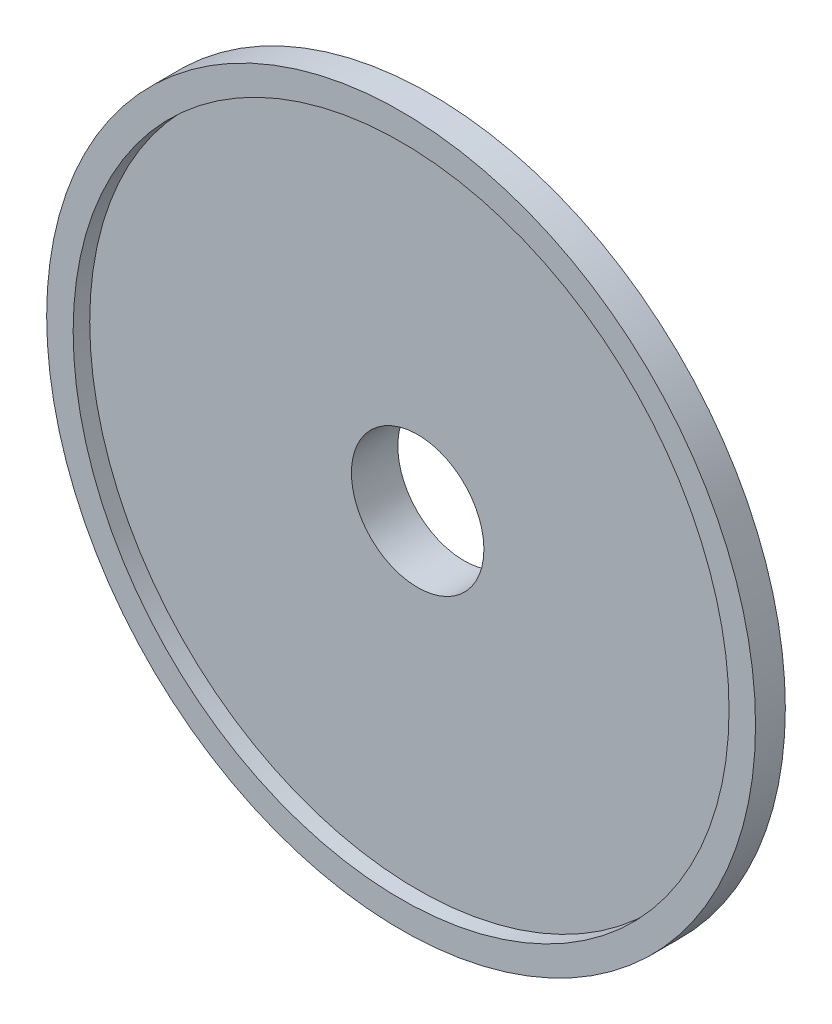
ISO-10303-21;
HEADER;
FILE_DESCRIPTION(('STEP AP214'),'2;1');
FILE_NAME('part.step','',(''),(''),'','','');
FILE_SCHEMA(('AUTOMOTIVE_DESIGN { 1 0 10303 214 1 1 1 1 }'));
ENDSEC;
DATA;
#1=APPLICATION_CONTEXT('core data for automotive mechanical design processes');
#2=APPLICATION_PROTOCOL_DEFINITION('international standard','automotive_design',2000,#1);
#3=PRODUCT_CONTEXT('',#1,'mechanical');
#4=PRODUCT('Part','Part','',(#3));
#5=PRODUCT_RELATED_PRODUCT_CATEGORY('part','',(#4));
#6=PRODUCT_DEFINITION_FORMATION('','',#4);
#7=PRODUCT_DEFINITION_CONTEXT('part definition',#1,'design');
#8=PRODUCT_DEFINITION('design','',#6,#7);
#9=PRODUCT_DEFINITION_SHAPE('','',#8);
#10=(LENGTH_UNIT() NAMED_UNIT(*) SI_UNIT(.MILLI.,.METRE.));
#11=(NAMED_UNIT(*) PLANE_ANGLE_UNIT() SI_UNIT($,.RADIAN.));
#12=(NAMED_UNIT(*) SI_UNIT($,.STERADIAN.) SOLID_ANGLE_UNIT());
#13=UNCERTAINTY_MEASURE_WITH_UNIT(LENGTH_MEASURE(1.E-05),#10,'distance_accuracy_value','');
#14=(GEOMETRIC_REPRESENTATION_CONTEXT(3) GLOBAL_UNCERTAINTY_ASSIGNED_CONTEXT((#13)) GLOBAL_UNIT_ASSIGNED_CONTEXT((#10,
#11,#12)) REPRESENTATION_CONTEXT('',''));
#15=CARTESIAN_POINT('',(0.,0.,0.));
#16=DIRECTION('',(0.,0.,1.));
#17=DIRECTION('',(1.,0.,0.));
#18=AXIS2_PLACEMENT_3D('',#15,#16,#17);
#19=CARTESIAN_POINT('',(0.,0.,-2.5));
#20=DIRECTION('',(0.,0.,1.));
#21=DIRECTION('',(1.,0.,0.));
#22=AXIS2_PLACEMENT_3D('',#19,#20,#21);
#23=CYLINDRICAL_SURFACE('',#22,10.);
#24=CARTESIAN_POINT('',(0.,0.,12.));
#25=DIRECTION('',(0.,0.,1.));
#26=DIRECTION('',(1.,0.,0.));
#27=AXIS2_PLACEMENT_3D('',#24,#25,#26);
#28=CIRCLE('',#27,10.);
#29=CARTESIAN_POINT('',(10.,0.,12.));
#30=VERTEX_POINT('',#29);
#31=EDGE_CURVE('E47',#30,#30,#28,.T.);
#32=CARTESIAN_POINT('',(0.,0.,5.));
#33=DIRECTION('',(0.,0.,-1.));
#34=DIRECTION('',(-1.,0.,0.));
#35=AXIS2_PLACEMENT_3D('',#32,#33,#34);
#36=CIRCLE('',#35,10.);
#37=CARTESIAN_POINT('',(10.,0.,5.));
#38=VERTEX_POINT('',#37);
#39=EDGE_CURVE('E35',#38,#38,#36,.F.);
#40=CARTESIAN_POINT('',(10.,0.,12.));
#41=CARTESIAN_POINT('',(10.,0.,11.9270833333333));
#42=CARTESIAN_POINT('',(10.,0.,11.8541666666667));
#43=CARTESIAN_POINT('',(10.,0.,11.7083333333333));
#44=CARTESIAN_POINT('',(10.,0.,11.6354166666667));
#45=CARTESIAN_POINT('',(10.,0.,11.4895833333333));
#46=CARTESIAN_POINT('',(10.,0.,11.4166666666667));
#47=CARTESIAN_POINT('',(10.,0.,11.2708333333333));
#48=CARTESIAN_POINT('',(10.,0.,11.1979166666667));
#49=CARTESIAN_POINT('',(10.,0.,11.0520833333333));
#50=CARTESIAN_POINT('',(10.,0.,10.9791666666667));
#51=CARTESIAN_POINT('',(10.,0.,10.8333333333333));
#52=CARTESIAN_POINT('',(10.,0.,10.7604166666667));
#53=CARTESIAN_POINT('',(10.,0.,10.6145833333333));
#54=CARTESIAN_POINT('',(10.,0.,10.5416666666667));
#55=CARTESIAN_POINT('',(10.,0.,10.3958333333333));
#56=CARTESIAN_POINT('',(10.,0.,10.3229166666667));
#57=CARTESIAN_POINT('',(10.,0.,10.1770833333333));
#58=CARTESIAN_POINT('',(10.,0.,10.1041666666667));
#59=CARTESIAN_POINT('',(10.,0.,9.95833333333333));
#60=CARTESIAN_POINT('',(10.,0.,9.88541666666667));
#61=CARTESIAN_POINT('',(10.,0.,9.73958333333333));
#62=CARTESIAN_POINT('',(10.,0.,9.66666666666667));
#63=CARTESIAN_POINT('',(10.,0.,9.52083333333333));
#64=CARTESIAN_POINT('',(10.,0.,9.44791666666667));
#65=CARTESIAN_POINT('',(10.,0.,9.30208333333333));
#66=CARTESIAN_POINT('',(10.,0.,9.22916666666667));
#67=CARTESIAN_POINT('',(10.,0.,9.08333333333333));
#68=CARTESIAN_POINT('',(10.,0.,9.01041666666667));
#69=CARTESIAN_POINT('',(10.,0.,8.86458333333333));
#70=CARTESIAN_POINT('',(10.,0.,8.79166666666667));
#71=CARTESIAN_POINT('',(10.,0.,8.64583333333333));
#72=CARTESIAN_POINT('',(10.,0.,8.57291666666667));
#73=CARTESIAN_POINT('',(10.,0.,8.42708333333333));
#74=CARTESIAN_POINT('',(10.,0.,8.35416666666667));
#75=CARTESIAN_POINT('',(10.,0.,8.20833333333333));
#76=CARTESIAN_POINT('',(10.,0.,8.13541666666667));
#77=CARTESIAN_POINT('',(10.,0.,7.98958333333333));
#78=CARTESIAN_POINT('',(10.,0.,7.91666666666667));
#79=CARTESIAN_POINT('',(10.,0.,7.77083333333333));
#80=CARTESIAN_POINT('',(10.,0.,7.69791666666667));
#81=CARTESIAN_POINT('',(10.,0.,7.55208333333333));
#82=CARTESIAN_POINT('',(10.,0.,7.47916666666667));
#83=CARTESIAN_POINT('',(10.,0.,7.33333333333333));
#84=CARTESIAN_POINT('',(10.,0.,7.26041666666667));
#85=CARTESIAN_POINT('',(10.,0.,7.11458333333333));
#86=CARTESIAN_POINT('',(10.,0.,7.04166666666667));
#87=CARTESIAN_POINT('',(10.,0.,6.89583333333333));
#88=CARTESIAN_POINT('',(10.,0.,6.82291666666667));
#89=CARTESIAN_POINT('',(10.,0.,6.67708333333333));
#90=CARTESIAN_POINT('',(10.,0.,6.60416666666667));
#91=CARTESIAN_POINT('',(10.,0.,6.45833333333333));
#92=CARTESIAN_POINT('',(10.,0.,6.38541666666667));
#93=CARTESIAN_POINT('',(10.,0.,6.23958333333333));
#94=CARTESIAN_POINT('',(10.,0.,6.16666666666667));
#95=CARTESIAN_POINT('',(10.,0.,6.02083333333333));
#96=CARTESIAN_POINT('',(10.,0.,5.94791666666666));
#97=CARTESIAN_POINT('',(10.,0.,5.80208333333333));
#98=CARTESIAN_POINT('',(10.,0.,5.72916666666666));
#99=CARTESIAN_POINT('',(10.,0.,5.58333333333333));
#100=CARTESIAN_POINT('',(10.,0.,5.51041666666667));
#101=CARTESIAN_POINT('',(10.,0.,5.36458333333333));
#102=CARTESIAN_POINT('',(10.,0.,5.29166666666667));
#103=CARTESIAN_POINT('',(10.,0.,5.14583333333333));
#104=CARTESIAN_POINT('',(10.,0.,5.07291666666667));
#105=CARTESIAN_POINT('',(10.,0.,5.));
#106=B_SPLINE_CURVE_WITH_KNOTS('',3,(#40,#41,#42,#43,#44,#45,#46,#47,#48,#49,#50,#51,#52,#53,
#54,#55,#56,#57,#58,#59,#60,#61,#62,#63,#64,#65,#66,#67,#68,#69,#70,#71,#72,#73,#74,#75,#76,#77,
#78,#79,#80,#81,#82,#83,#84,#85,#86,#87,#88,#89,#90,#91,#92,#93,#94,#95,#96,#97,#98,#99,#100,
#101,#102,#103,#104,#105),.UNSPECIFIED.,.F.,.F.,(4,2,2,2,2,2,2,2,2,2,2,2,2,2,2,2,2,2,2,2,2,2,2,
2,2,2,2,2,2,2,2,2,4),(0.,0.21875,0.4375,0.656250000000001,0.875000000000001,1.09375,1.3125,
1.53125,1.75,1.96875,2.1875,2.40625,2.625,2.84375,3.0625,3.28125,3.5,3.71875,3.9375,4.15625,
4.375,4.59375,4.8125,5.03125,5.25,5.46875,5.6875,5.90625,6.125,6.34375,6.5625,6.78125,7.),.UNSPECIFIED.);
#107=EDGE_CURVE('BSEAM31',#30,#38,#106,.T.);
#108=ORIENTED_EDGE('',*,*,#31,.T.);
#109=ORIENTED_EDGE('',*,*,#39,.F.);
#110=ORIENTED_EDGE('',*,*,#107,.T.);
#111=ORIENTED_EDGE('',*,*,#107,.F.);
#112=EDGE_LOOP('',(#108,#110,#109,#111));
#113=FACE_BOUND('',#112,.T.);
#114=ADVANCED_FACE('F31',(#113),#23,.F.);
#115=CARTESIAN_POINT('',(0.,0.,14.5));
#116=DIRECTION('',(0.,0.,-1.));
#117=DIRECTION('',(-1.,0.,0.));
#118=AXIS2_PLACEMENT_3D('',#115,#116,#117);
#119=CYLINDRICAL_SURFACE('',#118,53.5);
#120=CARTESIAN_POINT('',(0.,0.,14.5));
#121=DIRECTION('',(0.,0.,1.));
#122=DIRECTION('',(1.,0.,0.));
#123=AXIS2_PLACEMENT_3D('',#120,#121,#122);
#124=CIRCLE('',#123,53.5);
#125=CARTESIAN_POINT('',(-53.5,0.,14.5));
#126=VERTEX_POINT('',#125);
#127=EDGE_CURVE('E10',#126,#126,#124,.T.);
#128=CARTESIAN_POINT('',(0.,0.,10.));
#129=DIRECTION('',(0.,0.,-1.));
#130=DIRECTION('',(-1.,0.,0.));
#131=AXIS2_PLACEMENT_3D('',#128,#129,#130);
#132=CIRCLE('',#131,53.5);
#133=CARTESIAN_POINT('',(-53.5,0.,10.));
#134=VERTEX_POINT('',#133);
#135=EDGE_CURVE('E51',#134,#134,#132,.T.);
#136=CARTESIAN_POINT('',(-53.5,0.,14.5));
#137=CARTESIAN_POINT('',(-53.5,0.,14.453125));
#138=CARTESIAN_POINT('',(-53.5,0.,14.40625));
#139=CARTESIAN_POINT('',(-53.5,0.,14.3125));
#140=CARTESIAN_POINT('',(-53.5,0.,14.265625));
#141=CARTESIAN_POINT('',(-53.5,0.,14.171875));
#142=CARTESIAN_POINT('',(-53.5,0.,14.125));
#143=CARTESIAN_POINT('',(-53.5,0.,14.03125));
#144=CARTESIAN_POINT('',(-53.5,0.,13.984375));
#145=CARTESIAN_POINT('',(-53.5,0.,13.890625));
#146=CARTESIAN_POINT('',(-53.5,0.,13.84375));
#147=CARTESIAN_POINT('',(-53.5,0.,13.75));
#148=CARTESIAN_POINT('',(-53.5,0.,13.703125));
#149=CARTESIAN_POINT('',(-53.5,0.,13.609375));
#150=CARTESIAN_POINT('',(-53.5,0.,13.5625));
#151=CARTESIAN_POINT('',(-53.5,0.,13.46875));
#152=CARTESIAN_POINT('',(-53.5,0.,13.421875));
#153=CARTESIAN_POINT('',(-53.5,0.,13.328125));
#154=CARTESIAN_POINT('',(-53.5,0.,13.28125));
#155=CARTESIAN_POINT('',(-53.5,0.,13.1875));
#156=CARTESIAN_POINT('',(-53.5,0.,13.140625));
#157=CARTESIAN_POINT('',(-53.5,0.,13.046875));
#158=CARTESIAN_POINT('',(-53.5,0.,13.));
#159=CARTESIAN_POINT('',(-53.5,0.,12.90625));
#160=CARTESIAN_POINT('',(-53.5,0.,12.859375));
#161=CARTESIAN_POINT('',(-53.5,0.,12.765625));
#162=CARTESIAN_POINT('',(-53.5,0.,12.71875));
#163=CARTESIAN_POINT('',(-53.5,0.,12.625));
#164=CARTESIAN_POINT('',(-53.5,0.,12.578125));
#165=CARTESIAN_POINT('',(-53.5,0.,12.484375));
#166=CARTESIAN_POINT('',(-53.5,0.,12.4375));
#167=CARTESIAN_POINT('',(-53.5,0.,12.34375));
#168=CARTESIAN_POINT('',(-53.5,0.,12.296875));
#169=CARTESIAN_POINT('',(-53.5,0.,12.203125));
#170=CARTESIAN_POINT('',(-53.5,0.,12.15625));
#171=CARTESIAN_POINT('',(-53.5,0.,12.0625));
#172=CARTESIAN_POINT('',(-53.5,0.,12.015625));
#173=CARTESIAN_POINT('',(-53.5,0.,11.921875));
#174=CARTESIAN_POINT('',(-53.5,0.,11.875));
#175=CARTESIAN_POINT('',(-53.5,0.,11.78125));
#176=CARTESIAN_POINT('',(-53.5,0.,11.734375));
#177=CARTESIAN_POINT('',(-53.5,0.,11.640625));
#178=CARTESIAN_POINT('',(-53.5,0.,11.59375));
#179=CARTESIAN_POINT('',(-53.5,0.,11.5));
#180=CARTESIAN_POINT('',(-53.5,0.,11.453125));
#181=CARTESIAN_POINT('',(-53.5,0.,11.359375));
#182=CARTESIAN_POINT('',(-53.5,0.,11.3125));
#183=CARTESIAN_POINT('',(-53.5,0.,11.21875));
#184=CARTESIAN_POINT('',(-53.5,0.,11.171875));
#185=CARTESIAN_POINT('',(-53.5,0.,11.078125));
#186=CARTESIAN_POINT('',(-53.5,0.,11.03125));
#187=CARTESIAN_POINT('',(-53.5,0.,10.9375));
#188=CARTESIAN_POINT('',(-53.5,0.,10.890625));
#189=CARTESIAN_POINT('',(-53.5,0.,10.796875));
#190=CARTESIAN_POINT('',(-53.5,0.,10.75));
#191=CARTESIAN_POINT('',(-53.5,0.,10.65625));
#192=CARTESIAN_POINT('',(-53.5,0.,10.609375));
#193=CARTESIAN_POINT('',(-53.5,0.,10.515625));
#194=CARTESIAN_POINT('',(-53.5,0.,10.46875));
#195=CARTESIAN_POINT('',(-53.5,0.,10.375));
#196=CARTESIAN_POINT('',(-53.5,0.,10.328125));
#197=CARTESIAN_POINT('',(-53.5,0.,10.234375));
#198=CARTESIAN_POINT('',(-53.5,0.,10.1875));
#199=CARTESIAN_POINT('',(-53.5,0.,10.09375));
#200=CARTESIAN_POINT('',(-53.5,0.,10.046875));
#201=CARTESIAN_POINT('',(-53.5,0.,10.));
#202=B_SPLINE_CURVE_WITH_KNOTS('',3,(#136,#137,#138,#139,#140,#141,#142,#143,#144,#145,#146,
#147,#148,#149,#150,#151,#152,#153,#154,#155,#156,#157,#158,#159,#160,#161,#162,#163,#164,#165,
#166,#167,#168,#169,#170,#171,#172,#173,#174,#175,#176,#177,#178,#179,#180,#181,#182,#183,#184,
#185,#186,#187,#188,#189,#190,#191,#192,#193,#194,#195,#196,#197,#198,#199,#200,#201),
.UNSPECIFIED.,.F.,.F.,(4,2,2,2,2,2,2,2,2,2,2,2,2,2,2,2,2,2,2,2,2,2,2,2,2,2,2,2,2,2,2,2,4),(0.,
0.140624999999998,0.281249999999999,0.421874999999999,0.562499999999999,0.703124999999999,
0.843749999999999,0.984374999999999,1.125,1.265625,1.40625,1.546875,1.6875,1.828125,1.96875,
2.109375,2.25,2.390625,2.53125,2.671875,2.8125,2.953125,3.09375,3.234375,3.375,3.515625,3.65625,
3.796875,3.9375,4.078125,4.21875,4.359375,4.5),.UNSPECIFIED.);
#203=EDGE_CURVE('BSEAM33',#126,#134,#202,.T.);
#204=ORIENTED_EDGE('',*,*,#127,.F.);
#205=ORIENTED_EDGE('',*,*,#135,.F.);
#206=ORIENTED_EDGE('',*,*,#203,.T.);
#207=ORIENTED_EDGE('',*,*,#203,.F.);
#208=EDGE_LOOP('',(#204,#206,#205,#207));
#209=FACE_BOUND('',#208,.T.);
#210=ADVANCED_FACE('F33',(#209),#119,.T.);
#211=CARTESIAN_POINT('',(0.,0.,0.));
#212=DIRECTION('',(0.,0.,1.));
#213=DIRECTION('',(1.,0.,0.));
#214=AXIS2_PLACEMENT_3D('',#211,#212,#213);
#215=PLANE('',#214);
#216=CARTESIAN_POINT('',(0.,0.,0.));
#217=DIRECTION('',(0.,0.,-1.));
#218=DIRECTION('',(-1.,0.,0.));
#219=AXIS2_PLACEMENT_3D('',#216,#217,#218);
#220=CIRCLE('',#219,27.8);
#221=CARTESIAN_POINT('',(-27.8,0.,0.));
#222=VERTEX_POINT('',#221);
#223=EDGE_CURVE('E60',#222,#222,#220,.T.);
#224=ORIENTED_EDGE('',*,*,#223,.F.);
#225=EDGE_LOOP('',(#224));
#226=FACE_BOUND('',#225,.T.);
#227=CARTESIAN_POINT('',(0.,0.,0.));
#228=DIRECTION('',(0.,0.,-1.));
#229=DIRECTION('',(-1.,0.,0.));
#230=AXIS2_PLACEMENT_3D('',#227,#228,#229);
#231=CIRCLE('',#230,30.);
#232=CARTESIAN_POINT('',(-30.,0.,0.));
#233=VERTEX_POINT('',#232);
#234=EDGE_CURVE('E55',#233,#233,#231,.T.);
#235=ORIENTED_EDGE('',*,*,#234,.T.);
#236=EDGE_LOOP('',(#235));
#237=FACE_BOUND('',#236,.T.);
#238=ADVANCED_FACE('F78',(#226,#237),#215,.F.);
#239=CARTESIAN_POINT('',(0.,0.,14.5));
#240=DIRECTION('',(0.,0.,1.));
#241=DIRECTION('',(1.,0.,0.));
#242=AXIS2_PLACEMENT_3D('',#239,#240,#241);
#243=PLANE('',#242);
#244=CARTESIAN_POINT('',(0.,0.,14.5));
#245=DIRECTION('',(0.,0.,1.));
#246=DIRECTION('',(1.,0.,0.));
#247=AXIS2_PLACEMENT_3D('',#244,#245,#246);
#248=CIRCLE('',#247,49.5);
#249=CARTESIAN_POINT('',(49.5,0.,14.5));
#250=VERTEX_POINT('',#249);
#251=EDGE_CURVE('E43',#250,#250,#248,.T.);
#252=ORIENTED_EDGE('',*,*,#251,.F.);
#253=EDGE_LOOP('',(#252));
#254=FACE_BOUND('',#253,.T.);
#255=ORIENTED_EDGE('',*,*,#127,.T.);
#256=EDGE_LOOP('',(#255));
#257=FACE_BOUND('',#256,.T.);
#258=ADVANCED_FACE('F91',(#254,#257),#243,.T.);
#259=CARTESIAN_POINT('',(0.,0.,12.));
#260=DIRECTION('',(0.,0.,1.));
#261=DIRECTION('',(1.,0.,0.));
#262=AXIS2_PLACEMENT_3D('',#259,#260,#261);
#263=CYLINDRICAL_SURFACE('',#262,49.5);
#264=CARTESIAN_POINT('',(0.,0.,12.));
#265=DIRECTION('',(0.,0.,1.));
#266=DIRECTION('',(1.,0.,0.));
#267=AXIS2_PLACEMENT_3D('',#264,#265,#266);
#268=CIRCLE('',#267,49.5);
#269=CARTESIAN_POINT('',(49.5,0.,12.));
#270=VERTEX_POINT('',#269);
#271=EDGE_CURVE('E39',#270,#270,#268,.T.);
#272=ORIENTED_EDGE('',*,*,#271,.F.);
#273=EDGE_LOOP('',(#272));
#274=FACE_BOUND('',#273,.T.);
#275=ORIENTED_EDGE('',*,*,#251,.T.);
#276=EDGE_LOOP('',(#275));
#277=FACE_BOUND('',#276,.T.);
#278=ADVANCED_FACE('F87',(#274,#277),#263,.F.);
#279=CARTESIAN_POINT('',(0.,0.,12.));
#280=DIRECTION('',(0.,0.,1.));
#281=DIRECTION('',(1.,0.,0.));
#282=AXIS2_PLACEMENT_3D('',#279,#280,#281);
#283=PLANE('',#282);
#284=ORIENTED_EDGE('',*,*,#31,.F.);
#285=EDGE_LOOP('',(#284));
#286=FACE_BOUND('',#285,.T.);
#287=ORIENTED_EDGE('',*,*,#271,.T.);
#288=EDGE_LOOP('',(#287));
#289=FACE_BOUND('',#288,.T.);
#290=ADVANCED_FACE('F84',(#286,#289),#283,.T.);
#291=CARTESIAN_POINT('',(0.,0.,10.));
#292=DIRECTION('',(0.,0.,-1.));
#293=DIRECTION('',(-1.,0.,0.));
#294=AXIS2_PLACEMENT_3D('',#291,#292,#293);
#295=PLANE('',#294);
#296=CARTESIAN_POINT('',(0.,0.,10.));
#297=DIRECTION('',(0.,0.,-1.));
#298=DIRECTION('',(-1.,0.,0.));
#299=AXIS2_PLACEMENT_3D('',#296,#297,#298);
#300=CIRCLE('',#299,30.);
#301=CARTESIAN_POINT('',(-30.,0.,10.));
#302=VERTEX_POINT('',#301);
#303=EDGE_CURVE('E54',#302,#302,#300,.T.);
#304=ORIENTED_EDGE('',*,*,#303,.F.);
#305=EDGE_LOOP('',(#304));
#306=FACE_BOUND('',#305,.T.);
#307=ORIENTED_EDGE('',*,*,#135,.T.);
#308=EDGE_LOOP('',(#307));
#309=FACE_BOUND('',#308,.T.);
#310=ADVANCED_FACE('F82',(#306,#309),#295,.T.);
#311=CARTESIAN_POINT('',(0.,0.,10.));
#312=DIRECTION('',(0.,0.,-1.));
#313=DIRECTION('',(-1.,0.,0.));
#314=AXIS2_PLACEMENT_3D('',#311,#312,#313);
#315=CYLINDRICAL_SURFACE('',#314,30.);
#316=ORIENTED_EDGE('',*,*,#303,.T.);
#317=EDGE_LOOP('',(#316));
#318=FACE_BOUND('',#317,.T.);
#319=ORIENTED_EDGE('',*,*,#234,.F.);
#320=EDGE_LOOP('',(#319));
#321=FACE_BOUND('',#320,.T.);
#322=ADVANCED_FACE('F103',(#318,#321),#315,.T.);
#323=CARTESIAN_POINT('',(0.,0.,5.));
#324=DIRECTION('',(0.,0.,-1.));
#325=DIRECTION('',(-1.,0.,0.));
#326=AXIS2_PLACEMENT_3D('',#323,#324,#325);
#327=PLANE('',#326);
#328=CARTESIAN_POINT('',(0.,0.,5.));
#329=DIRECTION('',(0.,0.,-1.));
#330=DIRECTION('',(-1.,0.,0.));
#331=AXIS2_PLACEMENT_3D('',#328,#329,#330);
#332=CIRCLE('',#331,27.8);
#333=CARTESIAN_POINT('',(-27.8,0.,5.));
#334=VERTEX_POINT('',#333);
#335=EDGE_CURVE('E63',#334,#334,#332,.T.);
#336=ORIENTED_EDGE('',*,*,#335,.T.);
#337=EDGE_LOOP('',(#336));
#338=FACE_BOUND('',#337,.T.);
#339=ORIENTED_EDGE('',*,*,#39,.T.);
#340=EDGE_LOOP('',(#339));
#341=FACE_BOUND('',#340,.T.);
#342=ADVANCED_FACE('F70',(#338,#341),#327,.T.);
#343=CARTESIAN_POINT('',(0.,0.,5.));
#344=DIRECTION('',(0.,0.,-1.));
#345=DIRECTION('',(-1.,0.,0.));
#346=AXIS2_PLACEMENT_3D('',#343,#344,#345);
#347=CYLINDRICAL_SURFACE('',#346,27.8);
#348=ORIENTED_EDGE('',*,*,#335,.F.);
#349=EDGE_LOOP('',(#348));
#350=FACE_BOUND('',#349,.T.);
#351=ORIENTED_EDGE('',*,*,#223,.T.);
#352=EDGE_LOOP('',(#351));
#353=FACE_BOUND('',#352,.T.);
#354=ADVANCED_FACE('F110',(#350,#353),#347,.F.);
#355=CLOSED_SHELL('',(#114,#210,#238,#258,#278,#290,#310,#322,#342,#354));
#356=MANIFOLD_SOLID_BREP('B2',#355);
#357=ADVANCED_BREP_SHAPE_REPRESENTATION('',(#18,#356),#14);
#358=SHAPE_DEFINITION_REPRESENTATION(#9,#357);
ENDSEC;
END-ISO-10303-21;
